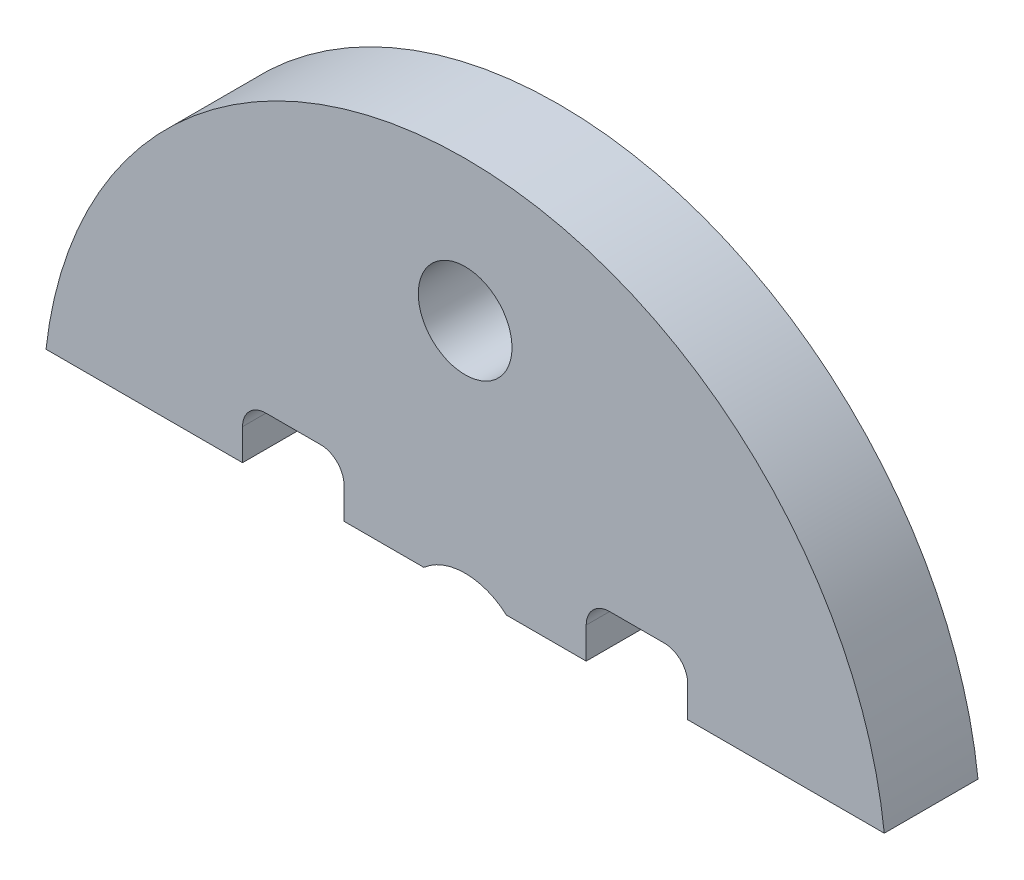
ISO-10303-21;
HEADER;
FILE_DESCRIPTION(('STEP AP214'),'2;1');
FILE_NAME('part.step','',(''),(''),'','','');
FILE_SCHEMA(('AUTOMOTIVE_DESIGN { 1 0 10303 214 1 1 1 1 }'));
ENDSEC;
DATA;
#1=APPLICATION_CONTEXT('core data for automotive mechanical design processes');
#2=APPLICATION_PROTOCOL_DEFINITION('international standard','automotive_design',2000,#1);
#3=PRODUCT_CONTEXT('',#1,'mechanical');
#4=PRODUCT('Part','Part','',(#3));
#5=PRODUCT_RELATED_PRODUCT_CATEGORY('part','',(#4));
#6=PRODUCT_DEFINITION_FORMATION('','',#4);
#7=PRODUCT_DEFINITION_CONTEXT('part definition',#1,'design');
#8=PRODUCT_DEFINITION('design','',#6,#7);
#9=PRODUCT_DEFINITION_SHAPE('','',#8);
#10=(LENGTH_UNIT() NAMED_UNIT(*) SI_UNIT(.MILLI.,.METRE.));
#11=(NAMED_UNIT(*) PLANE_ANGLE_UNIT() SI_UNIT($,.RADIAN.));
#12=(NAMED_UNIT(*) SI_UNIT($,.STERADIAN.) SOLID_ANGLE_UNIT());
#13=UNCERTAINTY_MEASURE_WITH_UNIT(LENGTH_MEASURE(1.E-05),#10,'distance_accuracy_value','');
#14=(GEOMETRIC_REPRESENTATION_CONTEXT(3) GLOBAL_UNCERTAINTY_ASSIGNED_CONTEXT((#13)) GLOBAL_UNIT_ASSIGNED_CONTEXT((#10,
#11,#12)) REPRESENTATION_CONTEXT('',''));
#15=CARTESIAN_POINT('',(0.,0.,0.));
#16=DIRECTION('',(0.,0.,1.));
#17=DIRECTION('',(1.,0.,0.));
#18=AXIS2_PLACEMENT_3D('',#15,#16,#17);
#19=CARTESIAN_POINT('',(22.61772233345,284.626884364716,3.));
#20=DIRECTION('',(0.,0.,1.));
#21=DIRECTION('',(1.,0.,0.));
#22=AXIS2_PLACEMENT_3D('',#19,#20,#21);
#23=PLANE('',#22);
#24=CARTESIAN_POINT('',(22.61772233345,284.626884364716,3.));
#25=DIRECTION('',(0.,0.,-1.));
#26=DIRECTION('',(1.,0.,0.));
#27=AXIS2_PLACEMENT_3D('',#24,#25,#26);
#28=CIRCLE('',#27,2.00000000000001);
#29=CARTESIAN_POINT('',(21.2948466779,286.1268843647,3.));
#30=VERTEX_POINT('',#29);
#31=CARTESIAN_POINT('',(23.940597989,286.1268843647,3.));
#32=VERTEX_POINT('',#31);
#33=EDGE_CURVE('E209',#30,#32,#28,.T.);
#34=ORIENTED_EDGE('',*,*,#33,.T.);
#35=DIRECTION('',(1.,0.,0.));
#36=VECTOR('',#35,1.);
#37=CARTESIAN_POINT('',(26.4927223335,286.1268843647,3.));
#38=LINE('',#37,#36);
#39=CARTESIAN_POINT('',(26.4927223335,286.1268843647,3.));
#40=VERTEX_POINT('',#39);
#41=EDGE_CURVE('E117',#32,#40,#38,.T.);
#42=ORIENTED_EDGE('',*,*,#41,.T.);
#43=DIRECTION('',(0.,1.,0.));
#44=VECTOR('',#43,1.);
#45=CARTESIAN_POINT('',(26.4927223335,287.1268843647,3.));
#46=LINE('',#45,#44);
#47=CARTESIAN_POINT('',(26.4927223335,287.1268843647,3.));
#48=VERTEX_POINT('',#47);
#49=EDGE_CURVE('E248',#40,#48,#46,.T.);
#50=ORIENTED_EDGE('',*,*,#49,.T.);
#51=CARTESIAN_POINT('',(27.2427223335,287.1268843647,3.));
#52=DIRECTION('',(0.,0.,-1.));
#53=DIRECTION('',(1.,0.,0.));
#54=AXIS2_PLACEMENT_3D('',#51,#52,#53);
#55=CIRCLE('',#54,0.749999999999987);
#56=CARTESIAN_POINT('',(27.2427223335,287.8768843647,3.));
#57=VERTEX_POINT('',#56);
#58=EDGE_CURVE('E267',#48,#57,#55,.T.);
#59=ORIENTED_EDGE('',*,*,#58,.T.);
#60=DIRECTION('',(1.,0.,0.));
#61=VECTOR('',#60,1.);
#62=CARTESIAN_POINT('',(28.9927223335,287.8768843647,3.));
#63=LINE('',#62,#61);
#64=CARTESIAN_POINT('',(28.9927223335,287.8768843647,3.));
#65=VERTEX_POINT('',#64);
#66=EDGE_CURVE('E264',#57,#65,#63,.T.);
#67=ORIENTED_EDGE('',*,*,#66,.T.);
#68=CARTESIAN_POINT('',(28.9927223335,287.1268843647,3.));
#69=DIRECTION('',(0.,0.,-1.));
#70=DIRECTION('',(1.,0.,0.));
#71=AXIS2_PLACEMENT_3D('',#68,#69,#70);
#72=CIRCLE('',#71,0.749999999999987);
#73=CARTESIAN_POINT('',(29.7427223335,287.1268843647,3.));
#74=VERTEX_POINT('',#73);
#75=EDGE_CURVE('E266',#65,#74,#72,.T.);
#76=ORIENTED_EDGE('',*,*,#75,.T.);
#77=DIRECTION('',(0.,-1.,0.));
#78=VECTOR('',#77,1.);
#79=CARTESIAN_POINT('',(29.7427223335,286.1268843647,3.));
#80=LINE('',#79,#78);
#81=CARTESIAN_POINT('',(29.7427223335,286.1268843647,3.));
#82=VERTEX_POINT('',#81);
#83=EDGE_CURVE('E269',#74,#82,#80,.T.);
#84=ORIENTED_EDGE('',*,*,#83,.T.);
#85=DIRECTION('',(1.,0.,0.));
#86=VECTOR('',#85,1.);
#87=CARTESIAN_POINT('',(36.0341301985,286.1268843647,3.));
#88=LINE('',#87,#86);
#89=CARTESIAN_POINT('',(36.0341301985,286.1268843647,3.));
#90=VERTEX_POINT('',#89);
#91=EDGE_CURVE('E275',#82,#90,#88,.T.);
#92=ORIENTED_EDGE('',*,*,#91,.T.);
#93=CARTESIAN_POINT('',(22.61772233345,284.626884364716,3.));
#94=DIRECTION('',(0.,0.,1.));
#95=DIRECTION('',(1.,0.,0.));
#96=AXIS2_PLACEMENT_3D('',#93,#94,#95);
#97=CIRCLE('',#96,13.4999999999995);
#98=CARTESIAN_POINT('',(9.20131446845061,286.126884364706,3.));
#99=VERTEX_POINT('',#98);
#100=EDGE_CURVE('E277',#90,#99,#97,.T.);
#101=ORIENTED_EDGE('',*,*,#100,.T.);
#102=DIRECTION('',(1.,0.,0.));
#103=VECTOR('',#102,1.);
#104=CARTESIAN_POINT('',(15.4927223335,286.1268843647,3.));
#105=LINE('',#104,#103);
#106=CARTESIAN_POINT('',(15.4927223335,286.1268843647,3.));
#107=VERTEX_POINT('',#106);
#108=EDGE_CURVE('E279',#99,#107,#105,.T.);
#109=ORIENTED_EDGE('',*,*,#108,.T.);
#110=DIRECTION('',(0.,1.,0.));
#111=VECTOR('',#110,1.);
#112=CARTESIAN_POINT('',(15.4927223335,286.1268843647,3.));
#113=LINE('',#112,#111);
#114=CARTESIAN_POINT('',(15.4927223335,287.1268843647,3.));
#115=VERTEX_POINT('',#114);
#116=EDGE_CURVE('E281',#107,#115,#113,.T.);
#117=ORIENTED_EDGE('',*,*,#116,.T.);
#118=CARTESIAN_POINT('',(16.2427223335,287.1268843647,3.));
#119=DIRECTION('',(0.,0.,-1.));
#120=DIRECTION('',(1.,0.,0.));
#121=AXIS2_PLACEMENT_3D('',#118,#119,#120);
#122=CIRCLE('',#121,0.749999999999946);
#123=CARTESIAN_POINT('',(16.2427223335,287.8768843647,3.));
#124=VERTEX_POINT('',#123);
#125=EDGE_CURVE('E283',#115,#124,#122,.T.);
#126=ORIENTED_EDGE('',*,*,#125,.T.);
#127=DIRECTION('',(1.,0.,0.));
#128=VECTOR('',#127,1.);
#129=CARTESIAN_POINT('',(16.2427223335,287.8768843647,3.));
#130=LINE('',#129,#128);
#131=CARTESIAN_POINT('',(17.9927223335,287.8768843647,3.));
#132=VERTEX_POINT('',#131);
#133=EDGE_CURVE('E160',#124,#132,#130,.T.);
#134=ORIENTED_EDGE('',*,*,#133,.T.);
#135=CARTESIAN_POINT('',(17.9927223335,287.1268843647,3.));
#136=DIRECTION('',(0.,0.,-1.));
#137=DIRECTION('',(1.,0.,0.));
#138=AXIS2_PLACEMENT_3D('',#135,#136,#137);
#139=CIRCLE('',#138,0.749999999999987);
#140=CARTESIAN_POINT('',(18.7427223335,287.1268843647,3.));
#141=VERTEX_POINT('',#140);
#142=EDGE_CURVE('E154',#132,#141,#139,.T.);
#143=ORIENTED_EDGE('',*,*,#142,.T.);
#144=DIRECTION('',(0.,-1.,0.));
#145=VECTOR('',#144,1.);
#146=CARTESIAN_POINT('',(18.7427223335,287.1268843647,3.));
#147=LINE('',#146,#145);
#148=CARTESIAN_POINT('',(18.7427223335,286.1268843647,3.));
#149=VERTEX_POINT('',#148);
#150=EDGE_CURVE('E158',#141,#149,#147,.T.);
#151=ORIENTED_EDGE('',*,*,#150,.T.);
#152=DIRECTION('',(1.,0.,0.));
#153=VECTOR('',#152,1.);
#154=CARTESIAN_POINT('',(21.2948466779,286.1268843647,3.));
#155=LINE('',#154,#153);
#156=EDGE_CURVE('E50',#149,#30,#155,.T.);
#157=ORIENTED_EDGE('',*,*,#156,.T.);
#158=EDGE_LOOP('',(#34,#42,#50,#59,#67,#76,#84,#92,#101,#109,#117,#126,#134,#143,#151,#157));
#159=FACE_BOUND('',#158,.T.);
#160=CARTESIAN_POINT('',(22.6177223335,293.6268843647,3.));
#161=DIRECTION('',(0.,0.,1.));
#162=DIRECTION('',(1.,0.,0.));
#163=AXIS2_PLACEMENT_3D('',#160,#161,#162);
#164=CIRCLE('',#163,1.5);
#165=CARTESIAN_POINT('',(24.1177223335,293.6268843647,3.));
#166=VERTEX_POINT('',#165);
#167=EDGE_CURVE('E182',#166,#166,#164,.T.);
#168=ORIENTED_EDGE('',*,*,#167,.F.);
#169=EDGE_LOOP('',(#168));
#170=FACE_BOUND('',#169,.T.);
#171=ADVANCED_FACE('F33',(#159,#170),#23,.T.);
#172=CARTESIAN_POINT('',(22.61772233345,284.626884364716,0.));
#173=DIRECTION('',(0.,0.,1.));
#174=DIRECTION('',(1.,0.,0.));
#175=AXIS2_PLACEMENT_3D('',#172,#173,#174);
#176=PLANE('',#175);
#177=CARTESIAN_POINT('',(22.61772233345,284.626884364716,0.));
#178=DIRECTION('',(0.,0.,-1.));
#179=DIRECTION('',(1.,0.,0.));
#180=AXIS2_PLACEMENT_3D('',#177,#178,#179);
#181=CIRCLE('',#180,2.00000000000001);
#182=CARTESIAN_POINT('',(21.2948466779,286.1268843647,0.));
#183=VERTEX_POINT('',#182);
#184=CARTESIAN_POINT('',(23.940597989,286.1268843647,0.));
#185=VERTEX_POINT('',#184);
#186=EDGE_CURVE('E178',#183,#185,#181,.T.);
#187=ORIENTED_EDGE('',*,*,#186,.F.);
#188=DIRECTION('',(1.,0.,0.));
#189=VECTOR('',#188,1.);
#190=CARTESIAN_POINT('',(21.2948466779,286.1268843647,0.));
#191=LINE('',#190,#189);
#192=CARTESIAN_POINT('',(18.7427223335,286.1268843647,0.));
#193=VERTEX_POINT('',#192);
#194=EDGE_CURVE('E109',#193,#183,#191,.T.);
#195=ORIENTED_EDGE('',*,*,#194,.F.);
#196=DIRECTION('',(0.,-1.,0.));
#197=VECTOR('',#196,1.);
#198=CARTESIAN_POINT('',(18.7427223335,287.1268843647,0.));
#199=LINE('',#198,#197);
#200=CARTESIAN_POINT('',(18.7427223335,287.1268843647,0.));
#201=VERTEX_POINT('',#200);
#202=EDGE_CURVE('E103',#201,#193,#199,.T.);
#203=ORIENTED_EDGE('',*,*,#202,.F.);
#204=CARTESIAN_POINT('',(17.9927223335,287.1268843647,0.));
#205=DIRECTION('',(0.,0.,-1.));
#206=DIRECTION('',(1.,0.,0.));
#207=AXIS2_PLACEMENT_3D('',#204,#205,#206);
#208=CIRCLE('',#207,0.749999999999987);
#209=CARTESIAN_POINT('',(17.9927223335,287.8768843647,0.));
#210=VERTEX_POINT('',#209);
#211=EDGE_CURVE('E168',#210,#201,#208,.T.);
#212=ORIENTED_EDGE('',*,*,#211,.F.);
#213=DIRECTION('',(1.,0.,0.));
#214=VECTOR('',#213,1.);
#215=CARTESIAN_POINT('',(16.2427223335,287.8768843647,0.));
#216=LINE('',#215,#214);
#217=CARTESIAN_POINT('',(16.2427223335,287.8768843647,0.));
#218=VERTEX_POINT('',#217);
#219=EDGE_CURVE('E204',#218,#210,#216,.T.);
#220=ORIENTED_EDGE('',*,*,#219,.F.);
#221=CARTESIAN_POINT('',(16.2427223335,287.1268843647,0.));
#222=DIRECTION('',(0.,0.,-1.));
#223=DIRECTION('',(1.,0.,0.));
#224=AXIS2_PLACEMENT_3D('',#221,#222,#223);
#225=CIRCLE('',#224,0.749999999999946);
#226=CARTESIAN_POINT('',(15.4927223335,287.1268843647,0.));
#227=VERTEX_POINT('',#226);
#228=EDGE_CURVE('E202',#227,#218,#225,.T.);
#229=ORIENTED_EDGE('',*,*,#228,.F.);
#230=DIRECTION('',(0.,1.,0.));
#231=VECTOR('',#230,1.);
#232=CARTESIAN_POINT('',(15.4927223335,286.1268843647,0.));
#233=LINE('',#232,#231);
#234=CARTESIAN_POINT('',(15.4927223335,286.1268843647,0.));
#235=VERTEX_POINT('',#234);
#236=EDGE_CURVE('E200',#235,#227,#233,.T.);
#237=ORIENTED_EDGE('',*,*,#236,.F.);
#238=DIRECTION('',(1.,0.,0.));
#239=VECTOR('',#238,1.);
#240=CARTESIAN_POINT('',(15.4927223335,286.1268843647,0.));
#241=LINE('',#240,#239);
#242=CARTESIAN_POINT('',(9.20131446845061,286.126884364706,0.));
#243=VERTEX_POINT('',#242);
#244=EDGE_CURVE('E198',#243,#235,#241,.T.);
#245=ORIENTED_EDGE('',*,*,#244,.F.);
#246=CARTESIAN_POINT('',(22.61772233345,284.626884364716,0.));
#247=DIRECTION('',(0.,0.,1.));
#248=DIRECTION('',(1.,0.,0.));
#249=AXIS2_PLACEMENT_3D('',#246,#247,#248);
#250=CIRCLE('',#249,13.4999999999995);
#251=CARTESIAN_POINT('',(36.0341301985,286.1268843647,0.));
#252=VERTEX_POINT('',#251);
#253=EDGE_CURVE('E196',#252,#243,#250,.T.);
#254=ORIENTED_EDGE('',*,*,#253,.F.);
#255=DIRECTION('',(1.,0.,0.));
#256=VECTOR('',#255,1.);
#257=CARTESIAN_POINT('',(36.0341301985,286.1268843647,0.));
#258=LINE('',#257,#256);
#259=CARTESIAN_POINT('',(29.7427223335,286.1268843647,0.));
#260=VERTEX_POINT('',#259);
#261=EDGE_CURVE('E194',#260,#252,#258,.T.);
#262=ORIENTED_EDGE('',*,*,#261,.F.);
#263=DIRECTION('',(0.,-1.,0.));
#264=VECTOR('',#263,1.);
#265=CARTESIAN_POINT('',(29.7427223335,286.1268843647,0.));
#266=LINE('',#265,#264);
#267=CARTESIAN_POINT('',(29.7427223335,287.1268843647,0.));
#268=VERTEX_POINT('',#267);
#269=EDGE_CURVE('E192',#268,#260,#266,.T.);
#270=ORIENTED_EDGE('',*,*,#269,.F.);
#271=CARTESIAN_POINT('',(28.9927223335,287.1268843647,0.));
#272=DIRECTION('',(0.,0.,-1.));
#273=DIRECTION('',(1.,0.,0.));
#274=AXIS2_PLACEMENT_3D('',#271,#272,#273);
#275=CIRCLE('',#274,0.749999999999987);
#276=CARTESIAN_POINT('',(28.9927223335,287.8768843647,0.));
#277=VERTEX_POINT('',#276);
#278=EDGE_CURVE('E190',#277,#268,#275,.T.);
#279=ORIENTED_EDGE('',*,*,#278,.F.);
#280=DIRECTION('',(1.,0.,0.));
#281=VECTOR('',#280,1.);
#282=CARTESIAN_POINT('',(28.9927223335,287.8768843647,0.));
#283=LINE('',#282,#281);
#284=CARTESIAN_POINT('',(27.2427223335,287.8768843647,0.));
#285=VERTEX_POINT('',#284);
#286=EDGE_CURVE('E188',#285,#277,#283,.T.);
#287=ORIENTED_EDGE('',*,*,#286,.F.);
#288=CARTESIAN_POINT('',(27.2427223335,287.1268843647,0.));
#289=DIRECTION('',(0.,0.,-1.));
#290=DIRECTION('',(1.,0.,0.));
#291=AXIS2_PLACEMENT_3D('',#288,#289,#290);
#292=CIRCLE('',#291,0.749999999999987);
#293=CARTESIAN_POINT('',(26.4927223335,287.1268843647,0.));
#294=VERTEX_POINT('',#293);
#295=EDGE_CURVE('E186',#294,#285,#292,.T.);
#296=ORIENTED_EDGE('',*,*,#295,.F.);
#297=DIRECTION('',(0.,1.,0.));
#298=VECTOR('',#297,1.);
#299=CARTESIAN_POINT('',(26.4927223335,287.1268843647,0.));
#300=LINE('',#299,#298);
#301=CARTESIAN_POINT('',(26.4927223335,286.1268843647,0.));
#302=VERTEX_POINT('',#301);
#303=EDGE_CURVE('E184',#302,#294,#300,.T.);
#304=ORIENTED_EDGE('',*,*,#303,.F.);
#305=DIRECTION('',(1.,0.,0.));
#306=VECTOR('',#305,1.);
#307=CARTESIAN_POINT('',(26.4927223335,286.1268843647,0.));
#308=LINE('',#307,#306);
#309=EDGE_CURVE('E181',#185,#302,#308,.T.);
#310=ORIENTED_EDGE('',*,*,#309,.F.);
#311=EDGE_LOOP('',(#187,#195,#203,#212,#220,#229,#237,#245,#254,#262,#270,#279,#287,#296,#304,#310));
#312=FACE_BOUND('',#311,.T.);
#313=CARTESIAN_POINT('',(22.6177223335,293.6268843647,0.));
#314=DIRECTION('',(0.,0.,1.));
#315=DIRECTION('',(1.,0.,0.));
#316=AXIS2_PLACEMENT_3D('',#313,#314,#315);
#317=CIRCLE('',#316,1.5);
#318=CARTESIAN_POINT('',(24.1177223335,293.6268843647,0.));
#319=VERTEX_POINT('',#318);
#320=EDGE_CURVE('E482',#319,#319,#317,.T.);
#321=ORIENTED_EDGE('',*,*,#320,.T.);
#322=EDGE_LOOP('',(#321));
#323=FACE_BOUND('',#322,.T.);
#324=ADVANCED_FACE('F252',(#312,#323),#176,.F.);
#325=CARTESIAN_POINT('',(22.61772233345,284.626884364716,3.));
#326=DIRECTION('',(0.,0.,-1.));
#327=DIRECTION('',(-1.,0.,0.));
#328=AXIS2_PLACEMENT_3D('',#325,#326,#327);
#329=CYLINDRICAL_SURFACE('',#328,2.00000000000001);
#330=ORIENTED_EDGE('',*,*,#186,.T.);
#331=DIRECTION('',(0.,0.,-1.));
#332=VECTOR('',#331,1.);
#333=CARTESIAN_POINT('',(23.940597989,286.1268843647,3.));
#334=LINE('',#333,#332);
#335=EDGE_CURVE('E11',#32,#185,#334,.T.);
#336=ORIENTED_EDGE('',*,*,#335,.F.);
#337=ORIENTED_EDGE('',*,*,#33,.F.);
#338=DIRECTION('',(0.,0.,-1.));
#339=VECTOR('',#338,1.);
#340=CARTESIAN_POINT('',(21.2948466779,286.1268843647,3.));
#341=LINE('',#340,#339);
#342=EDGE_CURVE('E174',#30,#183,#341,.T.);
#343=ORIENTED_EDGE('',*,*,#342,.T.);
#344=EDGE_LOOP('',(#330,#336,#337,#343));
#345=FACE_BOUND('',#344,.T.);
#346=ADVANCED_FACE('F35',(#345),#329,.F.);
#347=CARTESIAN_POINT('',(26.4927223335,286.1268843647,3.));
#348=DIRECTION('',(0.,1.,0.));
#349=DIRECTION('',(0.,0.,1.));
#350=AXIS2_PLACEMENT_3D('',#347,#348,#349);
#351=PLANE('',#350);
#352=ORIENTED_EDGE('',*,*,#309,.T.);
#353=DIRECTION('',(0.,0.,-1.));
#354=VECTOR('',#353,1.);
#355=CARTESIAN_POINT('',(26.4927223335,286.1268843647,3.));
#356=LINE('',#355,#354);
#357=EDGE_CURVE('E42',#40,#302,#356,.T.);
#358=ORIENTED_EDGE('',*,*,#357,.F.);
#359=ORIENTED_EDGE('',*,*,#41,.F.);
#360=ORIENTED_EDGE('',*,*,#335,.T.);
#361=EDGE_LOOP('',(#352,#358,#359,#360));
#362=FACE_BOUND('',#361,.T.);
#363=ADVANCED_FACE('F317',(#362),#351,.F.);
#364=CARTESIAN_POINT('',(26.4927223335,287.1268843647,3.));
#365=DIRECTION('',(-1.,0.,0.));
#366=DIRECTION('',(0.,0.,1.));
#367=AXIS2_PLACEMENT_3D('',#364,#365,#366);
#368=PLANE('',#367);
#369=ORIENTED_EDGE('',*,*,#303,.T.);
#370=DIRECTION('',(0.,0.,-1.));
#371=VECTOR('',#370,1.);
#372=CARTESIAN_POINT('',(26.4927223335,287.1268843647,3.));
#373=LINE('',#372,#371);
#374=EDGE_CURVE('E240',#48,#294,#373,.T.);
#375=ORIENTED_EDGE('',*,*,#374,.F.);
#376=ORIENTED_EDGE('',*,*,#49,.F.);
#377=ORIENTED_EDGE('',*,*,#357,.T.);
#378=EDGE_LOOP('',(#369,#375,#376,#377));
#379=FACE_BOUND('',#378,.T.);
#380=ADVANCED_FACE('F246',(#379),#368,.F.);
#381=CARTESIAN_POINT('',(27.2427223335,287.1268843647,3.));
#382=DIRECTION('',(0.,0.,-1.));
#383=DIRECTION('',(-1.,0.,0.));
#384=AXIS2_PLACEMENT_3D('',#381,#382,#383);
#385=CYLINDRICAL_SURFACE('',#384,0.749999999999987);
#386=ORIENTED_EDGE('',*,*,#295,.T.);
#387=DIRECTION('',(0.,0.,-1.));
#388=VECTOR('',#387,1.);
#389=CARTESIAN_POINT('',(27.2427223335,287.8768843647,3.));
#390=LINE('',#389,#388);
#391=EDGE_CURVE('E237',#57,#285,#390,.T.);
#392=ORIENTED_EDGE('',*,*,#391,.F.);
#393=ORIENTED_EDGE('',*,*,#58,.F.);
#394=ORIENTED_EDGE('',*,*,#374,.T.);
#395=EDGE_LOOP('',(#386,#392,#393,#394));
#396=FACE_BOUND('',#395,.T.);
#397=ADVANCED_FACE('F258',(#396),#385,.F.);
#398=CARTESIAN_POINT('',(28.9927223335,287.8768843647,3.));
#399=DIRECTION('',(0.,1.,0.));
#400=DIRECTION('',(0.,0.,1.));
#401=AXIS2_PLACEMENT_3D('',#398,#399,#400);
#402=PLANE('',#401);
#403=ORIENTED_EDGE('',*,*,#286,.T.);
#404=DIRECTION('',(0.,0.,-1.));
#405=VECTOR('',#404,1.);
#406=CARTESIAN_POINT('',(28.9927223335,287.8768843647,3.));
#407=LINE('',#406,#405);
#408=EDGE_CURVE('E234',#65,#277,#407,.T.);
#409=ORIENTED_EDGE('',*,*,#408,.F.);
#410=ORIENTED_EDGE('',*,*,#66,.F.);
#411=ORIENTED_EDGE('',*,*,#391,.T.);
#412=EDGE_LOOP('',(#403,#409,#410,#411));
#413=FACE_BOUND('',#412,.T.);
#414=ADVANCED_FACE('F262',(#413),#402,.F.);
#415=CARTESIAN_POINT('',(28.9927223335,287.1268843647,3.));
#416=DIRECTION('',(0.,0.,-1.));
#417=DIRECTION('',(-1.,0.,0.));
#418=AXIS2_PLACEMENT_3D('',#415,#416,#417);
#419=CYLINDRICAL_SURFACE('',#418,0.749999999999987);
#420=ORIENTED_EDGE('',*,*,#278,.T.);
#421=DIRECTION('',(0.,0.,-1.));
#422=VECTOR('',#421,1.);
#423=CARTESIAN_POINT('',(29.7427223335,287.1268843647,3.));
#424=LINE('',#423,#422);
#425=EDGE_CURVE('E231',#74,#268,#424,.T.);
#426=ORIENTED_EDGE('',*,*,#425,.F.);
#427=ORIENTED_EDGE('',*,*,#75,.F.);
#428=ORIENTED_EDGE('',*,*,#408,.T.);
#429=EDGE_LOOP('',(#420,#426,#427,#428));
#430=FACE_BOUND('',#429,.T.);
#431=ADVANCED_FACE('F330',(#430),#419,.F.);
#432=CARTESIAN_POINT('',(29.7427223335,286.1268843647,3.));
#433=DIRECTION('',(1.,0.,0.));
#434=DIRECTION('',(0.,0.,-1.));
#435=AXIS2_PLACEMENT_3D('',#432,#433,#434);
#436=PLANE('',#435);
#437=ORIENTED_EDGE('',*,*,#269,.T.);
#438=DIRECTION('',(0.,0.,-1.));
#439=VECTOR('',#438,1.);
#440=CARTESIAN_POINT('',(29.7427223335,286.1268843647,3.));
#441=LINE('',#440,#439);
#442=EDGE_CURVE('E228',#82,#260,#441,.T.);
#443=ORIENTED_EDGE('',*,*,#442,.F.);
#444=ORIENTED_EDGE('',*,*,#83,.F.);
#445=ORIENTED_EDGE('',*,*,#425,.T.);
#446=EDGE_LOOP('',(#437,#443,#444,#445));
#447=FACE_BOUND('',#446,.T.);
#448=ADVANCED_FACE('F333',(#447),#436,.F.);
#449=CARTESIAN_POINT('',(36.0341301985,286.1268843647,3.));
#450=DIRECTION('',(0.,1.,0.));
#451=DIRECTION('',(0.,0.,1.));
#452=AXIS2_PLACEMENT_3D('',#449,#450,#451);
#453=PLANE('',#452);
#454=ORIENTED_EDGE('',*,*,#261,.T.);
#455=DIRECTION('',(0.,0.,-1.));
#456=VECTOR('',#455,1.);
#457=CARTESIAN_POINT('',(36.0341301985,286.1268843647,3.));
#458=LINE('',#457,#456);
#459=EDGE_CURVE('E225',#90,#252,#458,.T.);
#460=ORIENTED_EDGE('',*,*,#459,.F.);
#461=ORIENTED_EDGE('',*,*,#91,.F.);
#462=ORIENTED_EDGE('',*,*,#442,.T.);
#463=EDGE_LOOP('',(#454,#460,#461,#462));
#464=FACE_BOUND('',#463,.T.);
#465=ADVANCED_FACE('F337',(#464),#453,.F.);
#466=CARTESIAN_POINT('',(22.61772233345,284.626884364716,3.));
#467=DIRECTION('',(0.,0.,-1.));
#468=DIRECTION('',(-1.,0.,0.));
#469=AXIS2_PLACEMENT_3D('',#466,#467,#468);
#470=CYLINDRICAL_SURFACE('',#469,13.4999999999995);
#471=ORIENTED_EDGE('',*,*,#253,.T.);
#472=DIRECTION('',(0.,0.,-1.));
#473=VECTOR('',#472,1.);
#474=CARTESIAN_POINT('',(9.20131446845061,286.126884364706,3.));
#475=LINE('',#474,#473);
#476=EDGE_CURVE('E222',#99,#243,#475,.T.);
#477=ORIENTED_EDGE('',*,*,#476,.F.);
#478=ORIENTED_EDGE('',*,*,#100,.F.);
#479=ORIENTED_EDGE('',*,*,#459,.T.);
#480=EDGE_LOOP('',(#471,#477,#478,#479));
#481=FACE_BOUND('',#480,.T.);
#482=ADVANCED_FACE('F341',(#481),#470,.T.);
#483=CARTESIAN_POINT('',(15.4927223335,286.1268843647,3.));
#484=DIRECTION('',(0.,1.,0.));
#485=DIRECTION('',(0.,0.,1.));
#486=AXIS2_PLACEMENT_3D('',#483,#484,#485);
#487=PLANE('',#486);
#488=ORIENTED_EDGE('',*,*,#244,.T.);
#489=DIRECTION('',(0.,0.,-1.));
#490=VECTOR('',#489,1.);
#491=CARTESIAN_POINT('',(15.4927223335,286.1268843647,3.));
#492=LINE('',#491,#490);
#493=EDGE_CURVE('E219',#107,#235,#492,.T.);
#494=ORIENTED_EDGE('',*,*,#493,.F.);
#495=ORIENTED_EDGE('',*,*,#108,.F.);
#496=ORIENTED_EDGE('',*,*,#476,.T.);
#497=EDGE_LOOP('',(#488,#494,#495,#496));
#498=FACE_BOUND('',#497,.T.);
#499=ADVANCED_FACE('F345',(#498),#487,.F.);
#500=CARTESIAN_POINT('',(15.4927223335,286.1268843647,3.));
#501=DIRECTION('',(-1.,0.,0.));
#502=DIRECTION('',(0.,0.,1.));
#503=AXIS2_PLACEMENT_3D('',#500,#501,#502);
#504=PLANE('',#503);
#505=ORIENTED_EDGE('',*,*,#236,.T.);
#506=DIRECTION('',(0.,0.,-1.));
#507=VECTOR('',#506,1.);
#508=CARTESIAN_POINT('',(15.4927223335,287.1268843647,3.));
#509=LINE('',#508,#507);
#510=EDGE_CURVE('E216',#115,#227,#509,.T.);
#511=ORIENTED_EDGE('',*,*,#510,.F.);
#512=ORIENTED_EDGE('',*,*,#116,.F.);
#513=ORIENTED_EDGE('',*,*,#493,.T.);
#514=EDGE_LOOP('',(#505,#511,#512,#513));
#515=FACE_BOUND('',#514,.T.);
#516=ADVANCED_FACE('F349',(#515),#504,.F.);
#517=CARTESIAN_POINT('',(16.2427223335,287.1268843647,3.));
#518=DIRECTION('',(0.,0.,-1.));
#519=DIRECTION('',(-1.,0.,0.));
#520=AXIS2_PLACEMENT_3D('',#517,#518,#519);
#521=CYLINDRICAL_SURFACE('',#520,0.749999999999946);
#522=ORIENTED_EDGE('',*,*,#228,.T.);
#523=DIRECTION('',(0.,0.,-1.));
#524=VECTOR('',#523,1.);
#525=CARTESIAN_POINT('',(16.2427223335,287.8768843647,3.));
#526=LINE('',#525,#524);
#527=EDGE_CURVE('E213',#124,#218,#526,.T.);
#528=ORIENTED_EDGE('',*,*,#527,.F.);
#529=ORIENTED_EDGE('',*,*,#125,.F.);
#530=ORIENTED_EDGE('',*,*,#510,.T.);
#531=EDGE_LOOP('',(#522,#528,#529,#530));
#532=FACE_BOUND('',#531,.T.);
#533=ADVANCED_FACE('F289',(#532),#521,.F.);
#534=CARTESIAN_POINT('',(16.2427223335,287.8768843647,3.));
#535=DIRECTION('',(0.,1.,0.));
#536=DIRECTION('',(0.,0.,1.));
#537=AXIS2_PLACEMENT_3D('',#534,#535,#536);
#538=PLANE('',#537);
#539=ORIENTED_EDGE('',*,*,#219,.T.);
#540=DIRECTION('',(0.,0.,-1.));
#541=VECTOR('',#540,1.);
#542=CARTESIAN_POINT('',(17.9927223335,287.8768843647,3.));
#543=LINE('',#542,#541);
#544=EDGE_CURVE('E169',#132,#210,#543,.T.);
#545=ORIENTED_EDGE('',*,*,#544,.F.);
#546=ORIENTED_EDGE('',*,*,#133,.F.);
#547=ORIENTED_EDGE('',*,*,#527,.T.);
#548=EDGE_LOOP('',(#539,#545,#546,#547));
#549=FACE_BOUND('',#548,.T.);
#550=ADVANCED_FACE('F293',(#549),#538,.F.);
#551=CARTESIAN_POINT('',(17.9927223335,287.1268843647,3.));
#552=DIRECTION('',(0.,0.,-1.));
#553=DIRECTION('',(-1.,0.,0.));
#554=AXIS2_PLACEMENT_3D('',#551,#552,#553);
#555=CYLINDRICAL_SURFACE('',#554,0.749999999999987);
#556=ORIENTED_EDGE('',*,*,#211,.T.);
#557=DIRECTION('',(0.,0.,-1.));
#558=VECTOR('',#557,1.);
#559=CARTESIAN_POINT('',(18.7427223335,287.1268843647,3.));
#560=LINE('',#559,#558);
#561=EDGE_CURVE('E165',#141,#201,#560,.T.);
#562=ORIENTED_EDGE('',*,*,#561,.F.);
#563=ORIENTED_EDGE('',*,*,#142,.F.);
#564=ORIENTED_EDGE('',*,*,#544,.T.);
#565=EDGE_LOOP('',(#556,#562,#563,#564));
#566=FACE_BOUND('',#565,.T.);
#567=ADVANCED_FACE('F166',(#566),#555,.F.);
#568=CARTESIAN_POINT('',(18.7427223335,287.1268843647,3.));
#569=DIRECTION('',(1.,0.,0.));
#570=DIRECTION('',(0.,0.,-1.));
#571=AXIS2_PLACEMENT_3D('',#568,#569,#570);
#572=PLANE('',#571);
#573=ORIENTED_EDGE('',*,*,#202,.T.);
#574=DIRECTION('',(0.,0.,-1.));
#575=VECTOR('',#574,1.);
#576=CARTESIAN_POINT('',(18.7427223335,286.1268843647,3.));
#577=LINE('',#576,#575);
#578=EDGE_CURVE('E170',#149,#193,#577,.T.);
#579=ORIENTED_EDGE('',*,*,#578,.F.);
#580=ORIENTED_EDGE('',*,*,#150,.F.);
#581=ORIENTED_EDGE('',*,*,#561,.T.);
#582=EDGE_LOOP('',(#573,#579,#580,#581));
#583=FACE_BOUND('',#582,.T.);
#584=ADVANCED_FACE('F172',(#583),#572,.F.);
#585=CARTESIAN_POINT('',(21.2948466779,286.1268843647,3.));
#586=DIRECTION('',(0.,1.,0.));
#587=DIRECTION('',(0.,0.,1.));
#588=AXIS2_PLACEMENT_3D('',#585,#586,#587);
#589=PLANE('',#588);
#590=ORIENTED_EDGE('',*,*,#194,.T.);
#591=ORIENTED_EDGE('',*,*,#342,.F.);
#592=ORIENTED_EDGE('',*,*,#156,.F.);
#593=ORIENTED_EDGE('',*,*,#578,.T.);
#594=EDGE_LOOP('',(#590,#591,#592,#593));
#595=FACE_BOUND('',#594,.T.);
#596=ADVANCED_FACE('F297',(#595),#589,.F.);
#597=CARTESIAN_POINT('',(22.6177223335,293.6268843647,3.));
#598=DIRECTION('',(0.,0.,-1.));
#599=DIRECTION('',(-1.,0.,0.));
#600=AXIS2_PLACEMENT_3D('',#597,#598,#599);
#601=CYLINDRICAL_SURFACE('',#600,1.5);
#602=ORIENTED_EDGE('',*,*,#167,.T.);
#603=EDGE_LOOP('',(#602));
#604=FACE_BOUND('',#603,.T.);
#605=ORIENTED_EDGE('',*,*,#320,.F.);
#606=EDGE_LOOP('',(#605));
#607=FACE_BOUND('',#606,.T.);
#608=ADVANCED_FACE('F299',(#604,#607),#601,.F.);
#609=CLOSED_SHELL('',(#171,#324,#346,#363,#380,#397,#414,#431,#448,#465,#482,#499,#516,#533,
#550,#567,#584,#596,#608));
#610=MANIFOLD_SOLID_BREP('B2',#609);
#611=ADVANCED_BREP_SHAPE_REPRESENTATION('',(#18,#610),#14);
#612=SHAPE_DEFINITION_REPRESENTATION(#9,#611);
ENDSEC;
END-ISO-10303-21;
